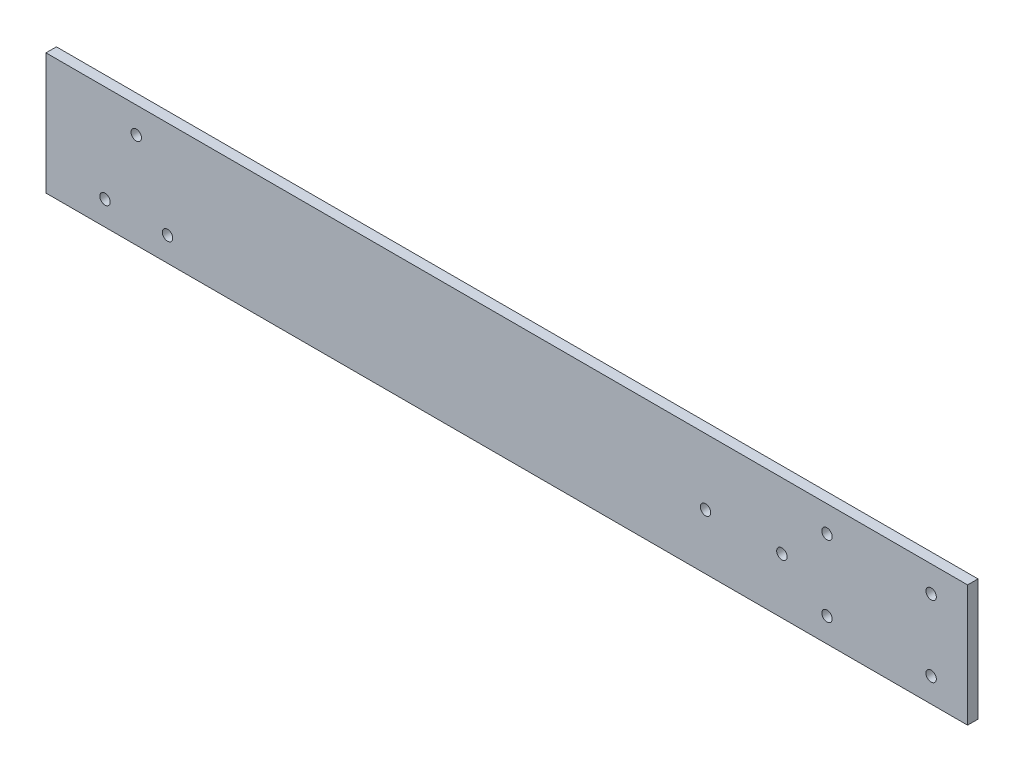
ISO-10303-21;
HEADER;
FILE_DESCRIPTION(('STEP AP214'),'2;1');
FILE_NAME('part.step','',(''),(''),'','','');
FILE_SCHEMA(('AUTOMOTIVE_DESIGN { 1 0 10303 214 1 1 1 1 }'));
ENDSEC;
DATA;
#1=APPLICATION_CONTEXT('core data for automotive mechanical design processes');
#2=APPLICATION_PROTOCOL_DEFINITION('international standard','automotive_design',2000,#1);
#3=PRODUCT_CONTEXT('',#1,'mechanical');
#4=PRODUCT('Part','Part','',(#3));
#5=PRODUCT_RELATED_PRODUCT_CATEGORY('part','',(#4));
#6=PRODUCT_DEFINITION_FORMATION('','',#4);
#7=PRODUCT_DEFINITION_CONTEXT('part definition',#1,'design');
#8=PRODUCT_DEFINITION('design','',#6,#7);
#9=PRODUCT_DEFINITION_SHAPE('','',#8);
#10=(LENGTH_UNIT() NAMED_UNIT(*) SI_UNIT(.MILLI.,.METRE.));
#11=(NAMED_UNIT(*) PLANE_ANGLE_UNIT() SI_UNIT($,.RADIAN.));
#12=(NAMED_UNIT(*) SI_UNIT($,.STERADIAN.) SOLID_ANGLE_UNIT());
#13=UNCERTAINTY_MEASURE_WITH_UNIT(LENGTH_MEASURE(1.E-05),#10,'distance_accuracy_value','');
#14=(GEOMETRIC_REPRESENTATION_CONTEXT(3) GLOBAL_UNCERTAINTY_ASSIGNED_CONTEXT((#13)) GLOBAL_UNIT_ASSIGNED_CONTEXT((#10,
#11,#12)) REPRESENTATION_CONTEXT('',''));
#15=CARTESIAN_POINT('',(0.,0.,0.));
#16=DIRECTION('',(0.,0.,1.));
#17=DIRECTION('',(1.,0.,0.));
#18=AXIS2_PLACEMENT_3D('',#15,#16,#17);
#19=CARTESIAN_POINT('',(0.,0.,3.));
#20=DIRECTION('',(0.,0.,1.));
#21=DIRECTION('',(1.,0.,0.));
#22=AXIS2_PLACEMENT_3D('',#19,#20,#21);
#23=PLANE('',#22);
#24=CARTESIAN_POINT('',(122.25,-10.5,3.));
#25=DIRECTION('',(0.,0.,1.));
#26=DIRECTION('',(1.,0.,0.));
#27=AXIS2_PLACEMENT_3D('',#24,#25,#26);
#28=CIRCLE('',#27,1.5);
#29=CARTESIAN_POINT('',(123.75,-10.5,3.));
#30=VERTEX_POINT('',#29);
#31=EDGE_CURVE('E163',#30,#30,#28,.T.);
#32=ORIENTED_EDGE('',*,*,#31,.F.);
#33=EDGE_LOOP('',(#32));
#34=FACE_BOUND('',#33,.T.);
#35=CARTESIAN_POINT('',(92.25,9.99999999999979,3.));
#36=DIRECTION('',(0.,0.,1.));
#37=DIRECTION('',(1.,0.,0.));
#38=AXIS2_PLACEMENT_3D('',#35,#36,#37);
#39=CIRCLE('',#38,1.5);
#40=CARTESIAN_POINT('',(93.75,9.99999999999979,3.));
#41=VERTEX_POINT('',#40);
#42=EDGE_CURVE('E151',#41,#41,#39,.T.);
#43=ORIENTED_EDGE('',*,*,#42,.F.);
#44=EDGE_LOOP('',(#43));
#45=FACE_BOUND('',#44,.T.);
#46=CARTESIAN_POINT('',(122.25,10.,3.));
#47=DIRECTION('',(0.,0.,1.));
#48=DIRECTION('',(1.,0.,0.));
#49=AXIS2_PLACEMENT_3D('',#46,#47,#48);
#50=CIRCLE('',#49,1.5);
#51=CARTESIAN_POINT('',(123.75,10.,3.));
#52=VERTEX_POINT('',#51);
#53=EDGE_CURVE('E139',#52,#52,#50,.T.);
#54=ORIENTED_EDGE('',*,*,#53,.F.);
#55=EDGE_LOOP('',(#54));
#56=FACE_BOUND('',#55,.T.);
#57=CARTESIAN_POINT('',(-97.75,-10.5,3.));
#58=DIRECTION('',(0.,0.,1.));
#59=DIRECTION('',(1.,0.,0.));
#60=AXIS2_PLACEMENT_3D('',#57,#58,#59);
#61=CIRCLE('',#60,1.5);
#62=CARTESIAN_POINT('',(-96.25,-10.5,3.));
#63=VERTEX_POINT('',#62);
#64=EDGE_CURVE('E127',#63,#63,#61,.T.);
#65=ORIENTED_EDGE('',*,*,#64,.F.);
#66=EDGE_LOOP('',(#65));
#67=FACE_BOUND('',#66,.T.);
#68=DIRECTION('',(0.,1.,0.));
#69=VECTOR('',#68,1.);
#70=CARTESIAN_POINT('',(132.75,17.5,3.));
#71=LINE('',#70,#69);
#72=CARTESIAN_POINT('',(132.75,-17.5,3.));
#73=VERTEX_POINT('',#72);
#74=CARTESIAN_POINT('',(132.75,17.5,3.));
#75=VERTEX_POINT('',#74);
#76=EDGE_CURVE('E97',#73,#75,#71,.T.);
#77=ORIENTED_EDGE('',*,*,#76,.T.);
#78=DIRECTION('',(-1.,0.,0.));
#79=VECTOR('',#78,1.);
#80=CARTESIAN_POINT('',(-132.75,17.5,3.));
#81=LINE('',#80,#79);
#82=CARTESIAN_POINT('',(-132.75,17.5,3.));
#83=VERTEX_POINT('',#82);
#84=EDGE_CURVE('E92',#75,#83,#81,.T.);
#85=ORIENTED_EDGE('',*,*,#84,.T.);
#86=DIRECTION('',(0.,-1.,0.));
#87=VECTOR('',#86,1.);
#88=CARTESIAN_POINT('',(-132.75,17.5,3.));
#89=LINE('',#88,#87);
#90=CARTESIAN_POINT('',(-132.75,-17.5,3.));
#91=VERTEX_POINT('',#90);
#92=EDGE_CURVE('E95',#83,#91,#89,.T.);
#93=ORIENTED_EDGE('',*,*,#92,.T.);
#94=DIRECTION('',(1.,0.,0.));
#95=VECTOR('',#94,1.);
#96=CARTESIAN_POINT('',(-132.75,-17.5,3.));
#97=LINE('',#96,#95);
#98=EDGE_CURVE('E62',#91,#73,#97,.T.);
#99=ORIENTED_EDGE('',*,*,#98,.T.);
#100=EDGE_LOOP('',(#77,#85,#93,#99));
#101=FACE_BOUND('',#100,.T.);
#102=CARTESIAN_POINT('',(-115.75,-10.5,3.));
#103=DIRECTION('',(0.,0.,1.));
#104=DIRECTION('',(1.,0.,0.));
#105=AXIS2_PLACEMENT_3D('',#102,#103,#104);
#106=CIRCLE('',#105,1.5);
#107=CARTESIAN_POINT('',(-114.25,-10.5,3.));
#108=VERTEX_POINT('',#107);
#109=EDGE_CURVE('E112',#108,#108,#106,.T.);
#110=ORIENTED_EDGE('',*,*,#109,.F.);
#111=EDGE_LOOP('',(#110));
#112=FACE_BOUND('',#111,.T.);
#113=CARTESIAN_POINT('',(-106.75,10.,3.));
#114=DIRECTION('',(0.,0.,1.));
#115=DIRECTION('',(1.,0.,0.));
#116=AXIS2_PLACEMENT_3D('',#113,#114,#115);
#117=CIRCLE('',#116,1.5);
#118=CARTESIAN_POINT('',(-105.25,10.,3.));
#119=VERTEX_POINT('',#118);
#120=EDGE_CURVE('E133',#119,#119,#117,.T.);
#121=ORIENTED_EDGE('',*,*,#120,.F.);
#122=EDGE_LOOP('',(#121));
#123=FACE_BOUND('',#122,.T.);
#124=CARTESIAN_POINT('',(79.2499999999989,-1.5,3.));
#125=DIRECTION('',(0.,0.,1.));
#126=DIRECTION('',(1.,0.,0.));
#127=AXIS2_PLACEMENT_3D('',#124,#125,#126);
#128=CIRCLE('',#127,1.5);
#129=CARTESIAN_POINT('',(80.7499999999989,-1.5,3.));
#130=VERTEX_POINT('',#129);
#131=EDGE_CURVE('E145',#130,#130,#128,.T.);
#132=ORIENTED_EDGE('',*,*,#131,.F.);
#133=EDGE_LOOP('',(#132));
#134=FACE_BOUND('',#133,.T.);
#135=CARTESIAN_POINT('',(92.2500000000002,-10.5000000000002,3.));
#136=DIRECTION('',(0.,0.,1.));
#137=DIRECTION('',(1.,0.,0.));
#138=AXIS2_PLACEMENT_3D('',#135,#136,#137);
#139=CIRCLE('',#138,1.5);
#140=CARTESIAN_POINT('',(93.7500000000002,-10.5000000000002,3.));
#141=VERTEX_POINT('',#140);
#142=EDGE_CURVE('E157',#141,#141,#139,.T.);
#143=ORIENTED_EDGE('',*,*,#142,.F.);
#144=EDGE_LOOP('',(#143));
#145=FACE_BOUND('',#144,.T.);
#146=CARTESIAN_POINT('',(57.2499999999984,-1.5,3.));
#147=DIRECTION('',(0.,0.,1.));
#148=DIRECTION('',(1.,0.,0.));
#149=AXIS2_PLACEMENT_3D('',#146,#147,#148);
#150=CIRCLE('',#149,1.5);
#151=CARTESIAN_POINT('',(58.7499999999984,-1.5,3.));
#152=VERTEX_POINT('',#151);
#153=EDGE_CURVE('E169',#152,#152,#150,.T.);
#154=ORIENTED_EDGE('',*,*,#153,.F.);
#155=EDGE_LOOP('',(#154));
#156=FACE_BOUND('',#155,.T.);
#157=ADVANCED_FACE('F45',(#34,#45,#56,#67,#101,#112,#123,#134,#145,#156),#23,.T.);
#158=CARTESIAN_POINT('',(0.,0.,0.));
#159=DIRECTION('',(0.,0.,1.));
#160=DIRECTION('',(1.,0.,0.));
#161=AXIS2_PLACEMENT_3D('',#158,#159,#160);
#162=PLANE('',#161);
#163=DIRECTION('',(0.,1.,0.));
#164=VECTOR('',#163,1.);
#165=CARTESIAN_POINT('',(132.75,17.5,0.));
#166=LINE('',#165,#164);
#167=CARTESIAN_POINT('',(132.75,-17.5,0.));
#168=VERTEX_POINT('',#167);
#169=CARTESIAN_POINT('',(132.75,17.5,0.));
#170=VERTEX_POINT('',#169);
#171=EDGE_CURVE('E109',#168,#170,#166,.T.);
#172=ORIENTED_EDGE('',*,*,#171,.F.);
#173=DIRECTION('',(1.,0.,0.));
#174=VECTOR('',#173,1.);
#175=CARTESIAN_POINT('',(-132.75,-17.5,0.));
#176=LINE('',#175,#174);
#177=CARTESIAN_POINT('',(-132.75,-17.5,0.));
#178=VERTEX_POINT('',#177);
#179=EDGE_CURVE('E85',#178,#168,#176,.T.);
#180=ORIENTED_EDGE('',*,*,#179,.F.);
#181=DIRECTION('',(0.,-1.,0.));
#182=VECTOR('',#181,1.);
#183=CARTESIAN_POINT('',(-132.75,17.5,0.));
#184=LINE('',#183,#182);
#185=CARTESIAN_POINT('',(-132.75,17.5,0.));
#186=VERTEX_POINT('',#185);
#187=EDGE_CURVE('E79',#186,#178,#184,.T.);
#188=ORIENTED_EDGE('',*,*,#187,.F.);
#189=DIRECTION('',(-1.,0.,0.));
#190=VECTOR('',#189,1.);
#191=CARTESIAN_POINT('',(-132.75,17.5,0.));
#192=LINE('',#191,#190);
#193=EDGE_CURVE('E101',#170,#186,#192,.T.);
#194=ORIENTED_EDGE('',*,*,#193,.F.);
#195=EDGE_LOOP('',(#172,#180,#188,#194));
#196=FACE_BOUND('',#195,.T.);
#197=CARTESIAN_POINT('',(-115.75,-10.5,0.));
#198=DIRECTION('',(0.,0.,1.));
#199=DIRECTION('',(1.,0.,0.));
#200=AXIS2_PLACEMENT_3D('',#197,#198,#199);
#201=CIRCLE('',#200,1.5);
#202=CARTESIAN_POINT('',(-114.25,-10.5,0.));
#203=VERTEX_POINT('',#202);
#204=EDGE_CURVE('E124',#203,#203,#201,.T.);
#205=ORIENTED_EDGE('',*,*,#204,.T.);
#206=EDGE_LOOP('',(#205));
#207=FACE_BOUND('',#206,.T.);
#208=CARTESIAN_POINT('',(-97.75,-10.5,0.));
#209=DIRECTION('',(0.,0.,1.));
#210=DIRECTION('',(1.,0.,0.));
#211=AXIS2_PLACEMENT_3D('',#208,#209,#210);
#212=CIRCLE('',#211,1.5);
#213=CARTESIAN_POINT('',(-96.25,-10.5,0.));
#214=VERTEX_POINT('',#213);
#215=EDGE_CURVE('E130',#214,#214,#212,.T.);
#216=ORIENTED_EDGE('',*,*,#215,.T.);
#217=EDGE_LOOP('',(#216));
#218=FACE_BOUND('',#217,.T.);
#219=CARTESIAN_POINT('',(-106.75,10.,0.));
#220=DIRECTION('',(0.,0.,1.));
#221=DIRECTION('',(1.,0.,0.));
#222=AXIS2_PLACEMENT_3D('',#219,#220,#221);
#223=CIRCLE('',#222,1.5);
#224=CARTESIAN_POINT('',(-105.25,10.,0.));
#225=VERTEX_POINT('',#224);
#226=EDGE_CURVE('E136',#225,#225,#223,.T.);
#227=ORIENTED_EDGE('',*,*,#226,.T.);
#228=EDGE_LOOP('',(#227));
#229=FACE_BOUND('',#228,.T.);
#230=CARTESIAN_POINT('',(122.25,10.,0.));
#231=DIRECTION('',(0.,0.,1.));
#232=DIRECTION('',(1.,0.,0.));
#233=AXIS2_PLACEMENT_3D('',#230,#231,#232);
#234=CIRCLE('',#233,1.5);
#235=CARTESIAN_POINT('',(123.75,10.,0.));
#236=VERTEX_POINT('',#235);
#237=EDGE_CURVE('E142',#236,#236,#234,.T.);
#238=ORIENTED_EDGE('',*,*,#237,.T.);
#239=EDGE_LOOP('',(#238));
#240=FACE_BOUND('',#239,.T.);
#241=CARTESIAN_POINT('',(79.2499999999989,-1.5,0.));
#242=DIRECTION('',(0.,0.,1.));
#243=DIRECTION('',(1.,0.,0.));
#244=AXIS2_PLACEMENT_3D('',#241,#242,#243);
#245=CIRCLE('',#244,1.5);
#246=CARTESIAN_POINT('',(80.7499999999989,-1.5,0.));
#247=VERTEX_POINT('',#246);
#248=EDGE_CURVE('E148',#247,#247,#245,.T.);
#249=ORIENTED_EDGE('',*,*,#248,.T.);
#250=EDGE_LOOP('',(#249));
#251=FACE_BOUND('',#250,.T.);
#252=CARTESIAN_POINT('',(92.25,9.99999999999979,0.));
#253=DIRECTION('',(0.,0.,1.));
#254=DIRECTION('',(1.,0.,0.));
#255=AXIS2_PLACEMENT_3D('',#252,#253,#254);
#256=CIRCLE('',#255,1.5);
#257=CARTESIAN_POINT('',(93.75,9.99999999999979,0.));
#258=VERTEX_POINT('',#257);
#259=EDGE_CURVE('E154',#258,#258,#256,.T.);
#260=ORIENTED_EDGE('',*,*,#259,.T.);
#261=EDGE_LOOP('',(#260));
#262=FACE_BOUND('',#261,.T.);
#263=CARTESIAN_POINT('',(92.2500000000002,-10.5000000000002,0.));
#264=DIRECTION('',(0.,0.,1.));
#265=DIRECTION('',(1.,0.,0.));
#266=AXIS2_PLACEMENT_3D('',#263,#264,#265);
#267=CIRCLE('',#266,1.5);
#268=CARTESIAN_POINT('',(93.7500000000002,-10.5000000000002,0.));
#269=VERTEX_POINT('',#268);
#270=EDGE_CURVE('E160',#269,#269,#267,.T.);
#271=ORIENTED_EDGE('',*,*,#270,.T.);
#272=EDGE_LOOP('',(#271));
#273=FACE_BOUND('',#272,.T.);
#274=CARTESIAN_POINT('',(122.25,-10.5,0.));
#275=DIRECTION('',(0.,0.,1.));
#276=DIRECTION('',(1.,0.,0.));
#277=AXIS2_PLACEMENT_3D('',#274,#275,#276);
#278=CIRCLE('',#277,1.5);
#279=CARTESIAN_POINT('',(123.75,-10.5,0.));
#280=VERTEX_POINT('',#279);
#281=EDGE_CURVE('E166',#280,#280,#278,.T.);
#282=ORIENTED_EDGE('',*,*,#281,.T.);
#283=EDGE_LOOP('',(#282));
#284=FACE_BOUND('',#283,.T.);
#285=CARTESIAN_POINT('',(57.2499999999984,-1.5,0.));
#286=DIRECTION('',(0.,0.,1.));
#287=DIRECTION('',(1.,0.,0.));
#288=AXIS2_PLACEMENT_3D('',#285,#286,#287);
#289=CIRCLE('',#288,1.5);
#290=CARTESIAN_POINT('',(58.7499999999984,-1.5,0.));
#291=VERTEX_POINT('',#290);
#292=EDGE_CURVE('E172',#291,#291,#289,.T.);
#293=ORIENTED_EDGE('',*,*,#292,.T.);
#294=EDGE_LOOP('',(#293));
#295=FACE_BOUND('',#294,.T.);
#296=ADVANCED_FACE('F120',(#196,#207,#218,#229,#240,#251,#262,#273,#284,#295),#162,.F.);
#297=CARTESIAN_POINT('',(132.75,17.5,3.));
#298=DIRECTION('',(-1.,0.,0.));
#299=DIRECTION('',(0.,0.,1.));
#300=AXIS2_PLACEMENT_3D('',#297,#298,#299);
#301=PLANE('',#300);
#302=ORIENTED_EDGE('',*,*,#171,.T.);
#303=DIRECTION('',(0.,0.,-1.));
#304=VECTOR('',#303,1.);
#305=CARTESIAN_POINT('',(132.75,17.5,3.));
#306=LINE('',#305,#304);
#307=EDGE_CURVE('E11',#75,#170,#306,.T.);
#308=ORIENTED_EDGE('',*,*,#307,.F.);
#309=ORIENTED_EDGE('',*,*,#76,.F.);
#310=DIRECTION('',(0.,0.,-1.));
#311=VECTOR('',#310,1.);
#312=CARTESIAN_POINT('',(132.75,-17.5,3.));
#313=LINE('',#312,#311);
#314=EDGE_CURVE('E105',#73,#168,#313,.T.);
#315=ORIENTED_EDGE('',*,*,#314,.T.);
#316=EDGE_LOOP('',(#302,#308,#309,#315));
#317=FACE_BOUND('',#316,.T.);
#318=ADVANCED_FACE('F47',(#317),#301,.F.);
#319=CARTESIAN_POINT('',(-132.75,17.5,3.));
#320=DIRECTION('',(0.,-1.,0.));
#321=DIRECTION('',(0.,0.,-1.));
#322=AXIS2_PLACEMENT_3D('',#319,#320,#321);
#323=PLANE('',#322);
#324=ORIENTED_EDGE('',*,*,#193,.T.);
#325=DIRECTION('',(0.,0.,-1.));
#326=VECTOR('',#325,1.);
#327=CARTESIAN_POINT('',(-132.75,17.5,3.));
#328=LINE('',#327,#326);
#329=EDGE_CURVE('E54',#83,#186,#328,.T.);
#330=ORIENTED_EDGE('',*,*,#329,.F.);
#331=ORIENTED_EDGE('',*,*,#84,.F.);
#332=ORIENTED_EDGE('',*,*,#307,.T.);
#333=EDGE_LOOP('',(#324,#330,#331,#332));
#334=FACE_BOUND('',#333,.T.);
#335=ADVANCED_FACE('F100',(#334),#323,.F.);
#336=CARTESIAN_POINT('',(-132.75,17.5,3.));
#337=DIRECTION('',(1.,0.,0.));
#338=DIRECTION('',(0.,0.,-1.));
#339=AXIS2_PLACEMENT_3D('',#336,#337,#338);
#340=PLANE('',#339);
#341=ORIENTED_EDGE('',*,*,#187,.T.);
#342=DIRECTION('',(0.,0.,-1.));
#343=VECTOR('',#342,1.);
#344=CARTESIAN_POINT('',(-132.75,-17.5,3.));
#345=LINE('',#344,#343);
#346=EDGE_CURVE('E102',#91,#178,#345,.T.);
#347=ORIENTED_EDGE('',*,*,#346,.F.);
#348=ORIENTED_EDGE('',*,*,#92,.F.);
#349=ORIENTED_EDGE('',*,*,#329,.T.);
#350=EDGE_LOOP('',(#341,#347,#348,#349));
#351=FACE_BOUND('',#350,.T.);
#352=ADVANCED_FACE('F103',(#351),#340,.F.);
#353=CARTESIAN_POINT('',(-132.75,-17.5,3.));
#354=DIRECTION('',(0.,1.,0.));
#355=DIRECTION('',(0.,0.,1.));
#356=AXIS2_PLACEMENT_3D('',#353,#354,#355);
#357=PLANE('',#356);
#358=ORIENTED_EDGE('',*,*,#179,.T.);
#359=ORIENTED_EDGE('',*,*,#314,.F.);
#360=ORIENTED_EDGE('',*,*,#98,.F.);
#361=ORIENTED_EDGE('',*,*,#346,.T.);
#362=EDGE_LOOP('',(#358,#359,#360,#361));
#363=FACE_BOUND('',#362,.T.);
#364=ADVANCED_FACE('F117',(#363),#357,.F.);
#365=CARTESIAN_POINT('',(-115.75,-10.5,3.));
#366=DIRECTION('',(0.,0.,-1.));
#367=DIRECTION('',(-1.,0.,0.));
#368=AXIS2_PLACEMENT_3D('',#365,#366,#367);
#369=CYLINDRICAL_SURFACE('',#368,1.5);
#370=ORIENTED_EDGE('',*,*,#109,.T.);
#371=EDGE_LOOP('',(#370));
#372=FACE_BOUND('',#371,.T.);
#373=ORIENTED_EDGE('',*,*,#204,.F.);
#374=EDGE_LOOP('',(#373));
#375=FACE_BOUND('',#374,.T.);
#376=ADVANCED_FACE('F191',(#372,#375),#369,.F.);
#377=CARTESIAN_POINT('',(-97.75,-10.5,3.));
#378=DIRECTION('',(0.,0.,-1.));
#379=DIRECTION('',(-1.,0.,0.));
#380=AXIS2_PLACEMENT_3D('',#377,#378,#379);
#381=CYLINDRICAL_SURFACE('',#380,1.5);
#382=ORIENTED_EDGE('',*,*,#64,.T.);
#383=EDGE_LOOP('',(#382));
#384=FACE_BOUND('',#383,.T.);
#385=ORIENTED_EDGE('',*,*,#215,.F.);
#386=EDGE_LOOP('',(#385));
#387=FACE_BOUND('',#386,.T.);
#388=ADVANCED_FACE('F234',(#384,#387),#381,.F.);
#389=CARTESIAN_POINT('',(-106.75,10.,3.));
#390=DIRECTION('',(0.,0.,-1.));
#391=DIRECTION('',(-1.,0.,0.));
#392=AXIS2_PLACEMENT_3D('',#389,#390,#391);
#393=CYLINDRICAL_SURFACE('',#392,1.5);
#394=ORIENTED_EDGE('',*,*,#120,.T.);
#395=EDGE_LOOP('',(#394));
#396=FACE_BOUND('',#395,.T.);
#397=ORIENTED_EDGE('',*,*,#226,.F.);
#398=EDGE_LOOP('',(#397));
#399=FACE_BOUND('',#398,.T.);
#400=ADVANCED_FACE('F242',(#396,#399),#393,.F.);
#401=CARTESIAN_POINT('',(122.25,10.,3.));
#402=DIRECTION('',(0.,0.,-1.));
#403=DIRECTION('',(-1.,0.,0.));
#404=AXIS2_PLACEMENT_3D('',#401,#402,#403);
#405=CYLINDRICAL_SURFACE('',#404,1.5);
#406=ORIENTED_EDGE('',*,*,#53,.T.);
#407=EDGE_LOOP('',(#406));
#408=FACE_BOUND('',#407,.T.);
#409=ORIENTED_EDGE('',*,*,#237,.F.);
#410=EDGE_LOOP('',(#409));
#411=FACE_BOUND('',#410,.T.);
#412=ADVANCED_FACE('F250',(#408,#411),#405,.F.);
#413=CARTESIAN_POINT('',(79.2499999999989,-1.5,3.));
#414=DIRECTION('',(0.,0.,-1.));
#415=DIRECTION('',(-1.,0.,0.));
#416=AXIS2_PLACEMENT_3D('',#413,#414,#415);
#417=CYLINDRICAL_SURFACE('',#416,1.5);
#418=ORIENTED_EDGE('',*,*,#131,.T.);
#419=EDGE_LOOP('',(#418));
#420=FACE_BOUND('',#419,.T.);
#421=ORIENTED_EDGE('',*,*,#248,.F.);
#422=EDGE_LOOP('',(#421));
#423=FACE_BOUND('',#422,.T.);
#424=ADVANCED_FACE('F259',(#420,#423),#417,.F.);
#425=CARTESIAN_POINT('',(92.25,9.99999999999979,3.));
#426=DIRECTION('',(0.,0.,-1.));
#427=DIRECTION('',(-1.,0.,0.));
#428=AXIS2_PLACEMENT_3D('',#425,#426,#427);
#429=CYLINDRICAL_SURFACE('',#428,1.5);
#430=ORIENTED_EDGE('',*,*,#42,.T.);
#431=EDGE_LOOP('',(#430));
#432=FACE_BOUND('',#431,.T.);
#433=ORIENTED_EDGE('',*,*,#259,.F.);
#434=EDGE_LOOP('',(#433));
#435=FACE_BOUND('',#434,.T.);
#436=ADVANCED_FACE('F268',(#432,#435),#429,.F.);
#437=CARTESIAN_POINT('',(92.2500000000002,-10.5000000000002,3.));
#438=DIRECTION('',(0.,0.,-1.));
#439=DIRECTION('',(-1.,0.,0.));
#440=AXIS2_PLACEMENT_3D('',#437,#438,#439);
#441=CYLINDRICAL_SURFACE('',#440,1.5);
#442=ORIENTED_EDGE('',*,*,#142,.T.);
#443=EDGE_LOOP('',(#442));
#444=FACE_BOUND('',#443,.T.);
#445=ORIENTED_EDGE('',*,*,#270,.F.);
#446=EDGE_LOOP('',(#445));
#447=FACE_BOUND('',#446,.T.);
#448=ADVANCED_FACE('F277',(#444,#447),#441,.F.);
#449=CARTESIAN_POINT('',(122.25,-10.5,3.));
#450=DIRECTION('',(0.,0.,-1.));
#451=DIRECTION('',(-1.,0.,0.));
#452=AXIS2_PLACEMENT_3D('',#449,#450,#451);
#453=CYLINDRICAL_SURFACE('',#452,1.5);
#454=ORIENTED_EDGE('',*,*,#31,.T.);
#455=EDGE_LOOP('',(#454));
#456=FACE_BOUND('',#455,.T.);
#457=ORIENTED_EDGE('',*,*,#281,.F.);
#458=EDGE_LOOP('',(#457));
#459=FACE_BOUND('',#458,.T.);
#460=ADVANCED_FACE('F286',(#456,#459),#453,.F.);
#461=CARTESIAN_POINT('',(57.2499999999984,-1.5,3.));
#462=DIRECTION('',(0.,0.,-1.));
#463=DIRECTION('',(-1.,0.,0.));
#464=AXIS2_PLACEMENT_3D('',#461,#462,#463);
#465=CYLINDRICAL_SURFACE('',#464,1.5);
#466=ORIENTED_EDGE('',*,*,#153,.T.);
#467=EDGE_LOOP('',(#466));
#468=FACE_BOUND('',#467,.T.);
#469=ORIENTED_EDGE('',*,*,#292,.F.);
#470=EDGE_LOOP('',(#469));
#471=FACE_BOUND('',#470,.T.);
#472=ADVANCED_FACE('F178',(#468,#471),#465,.F.);
#473=CLOSED_SHELL('',(#157,#296,#318,#335,#352,#364,#376,#388,#400,#412,#424,#436,#448,#460,#472));
#474=MANIFOLD_SOLID_BREP('B2',#473);
#475=ADVANCED_BREP_SHAPE_REPRESENTATION('',(#18,#474),#14);
#476=SHAPE_DEFINITION_REPRESENTATION(#9,#475);
ENDSEC;
END-ISO-10303-21;
